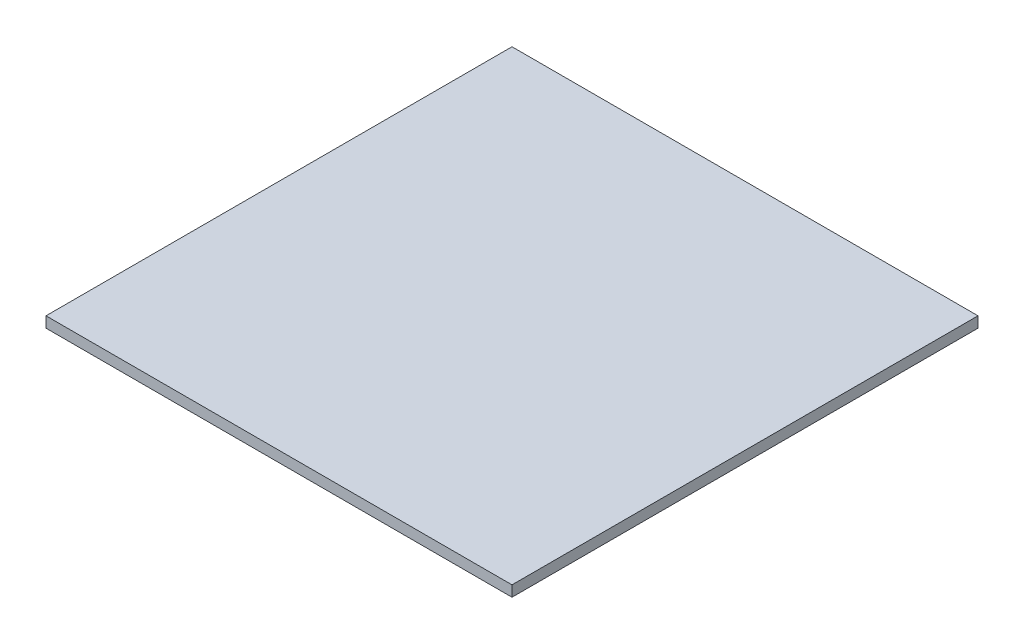
ISO-10303-21;
HEADER;
FILE_DESCRIPTION(('STEP AP214'),'2;1');
FILE_NAME('part.step','',(''),(''),'','','');
FILE_SCHEMA(('AUTOMOTIVE_DESIGN { 1 0 10303 214 1 1 1 1 }'));
ENDSEC;
DATA;
#1=APPLICATION_CONTEXT('core data for automotive mechanical design processes');
#2=APPLICATION_PROTOCOL_DEFINITION('international standard','automotive_design',2000,#1);
#3=PRODUCT_CONTEXT('',#1,'mechanical');
#4=PRODUCT('Part','Part','',(#3));
#5=PRODUCT_RELATED_PRODUCT_CATEGORY('part','',(#4));
#6=PRODUCT_DEFINITION_FORMATION('','',#4);
#7=PRODUCT_DEFINITION_CONTEXT('part definition',#1,'design');
#8=PRODUCT_DEFINITION('design','',#6,#7);
#9=PRODUCT_DEFINITION_SHAPE('','',#8);
#10=(LENGTH_UNIT() NAMED_UNIT(*) SI_UNIT(.MILLI.,.METRE.));
#11=(NAMED_UNIT(*) PLANE_ANGLE_UNIT() SI_UNIT($,.RADIAN.));
#12=(NAMED_UNIT(*) SI_UNIT($,.STERADIAN.) SOLID_ANGLE_UNIT());
#13=UNCERTAINTY_MEASURE_WITH_UNIT(LENGTH_MEASURE(1.E-05),#10,'distance_accuracy_value','');
#14=(GEOMETRIC_REPRESENTATION_CONTEXT(3) GLOBAL_UNCERTAINTY_ASSIGNED_CONTEXT((#13)) GLOBAL_UNIT_ASSIGNED_CONTEXT((#10,
#11,#12)) REPRESENTATION_CONTEXT('',''));
#15=CARTESIAN_POINT('',(0.,0.,0.));
#16=DIRECTION('',(0.,0.,1.));
#17=DIRECTION('',(1.,0.,0.));
#18=AXIS2_PLACEMENT_3D('',#15,#16,#17);
#19=CARTESIAN_POINT('',(130.,6.,130.));
#20=DIRECTION('',(-1.,0.,0.));
#21=DIRECTION('',(0.,0.,1.));
#22=AXIS2_PLACEMENT_3D('',#19,#20,#21);
#23=PLANE('',#22);
#24=DIRECTION('',(0.,0.,-1.));
#25=VECTOR('',#24,1.);
#26=CARTESIAN_POINT('',(130.,0.,130.));
#27=LINE('',#26,#25);
#28=CARTESIAN_POINT('',(130.,0.,130.));
#29=VERTEX_POINT('',#28);
#30=CARTESIAN_POINT('',(130.,0.,-130.));
#31=VERTEX_POINT('',#30);
#32=EDGE_CURVE('E107',#29,#31,#27,.T.);
#33=ORIENTED_EDGE('',*,*,#32,.T.);
#34=DIRECTION('',(0.,-1.,0.));
#35=VECTOR('',#34,1.);
#36=CARTESIAN_POINT('',(130.,6.,-130.));
#37=LINE('',#36,#35);
#38=CARTESIAN_POINT('',(130.,6.,-130.));
#39=VERTEX_POINT('',#38);
#40=EDGE_CURVE('E11',#39,#31,#37,.T.);
#41=ORIENTED_EDGE('',*,*,#40,.F.);
#42=DIRECTION('',(0.,0.,-1.));
#43=VECTOR('',#42,1.);
#44=CARTESIAN_POINT('',(130.,6.,130.));
#45=LINE('',#44,#43);
#46=CARTESIAN_POINT('',(130.,6.,130.));
#47=VERTEX_POINT('',#46);
#48=EDGE_CURVE('E91',#47,#39,#45,.T.);
#49=ORIENTED_EDGE('',*,*,#48,.F.);
#50=DIRECTION('',(0.,-1.,0.));
#51=VECTOR('',#50,1.);
#52=CARTESIAN_POINT('',(130.,6.,130.));
#53=LINE('',#52,#51);
#54=EDGE_CURVE('E103',#47,#29,#53,.T.);
#55=ORIENTED_EDGE('',*,*,#54,.T.);
#56=EDGE_LOOP('',(#33,#41,#49,#55));
#57=FACE_BOUND('',#56,.T.);
#58=ADVANCED_FACE('F39',(#57),#23,.F.);
#59=CARTESIAN_POINT('',(-130.,6.,-130.));
#60=DIRECTION('',(0.,0.,1.));
#61=DIRECTION('',(1.,0.,0.));
#62=AXIS2_PLACEMENT_3D('',#59,#60,#61);
#63=PLANE('',#62);
#64=DIRECTION('',(-1.,0.,0.));
#65=VECTOR('',#64,1.);
#66=CARTESIAN_POINT('',(-130.,0.,-130.));
#67=LINE('',#66,#65);
#68=CARTESIAN_POINT('',(-130.,0.,-130.));
#69=VERTEX_POINT('',#68);
#70=EDGE_CURVE('E96',#31,#69,#67,.T.);
#71=ORIENTED_EDGE('',*,*,#70,.T.);
#72=DIRECTION('',(0.,-1.,0.));
#73=VECTOR('',#72,1.);
#74=CARTESIAN_POINT('',(-130.,6.,-130.));
#75=LINE('',#74,#73);
#76=CARTESIAN_POINT('',(-130.,6.,-130.));
#77=VERTEX_POINT('',#76);
#78=EDGE_CURVE('E48',#77,#69,#75,.T.);
#79=ORIENTED_EDGE('',*,*,#78,.F.);
#80=DIRECTION('',(-1.,0.,0.));
#81=VECTOR('',#80,1.);
#82=CARTESIAN_POINT('',(-130.,6.,-130.));
#83=LINE('',#82,#81);
#84=EDGE_CURVE('E86',#39,#77,#83,.T.);
#85=ORIENTED_EDGE('',*,*,#84,.F.);
#86=ORIENTED_EDGE('',*,*,#40,.T.);
#87=EDGE_LOOP('',(#71,#79,#85,#86));
#88=FACE_BOUND('',#87,.T.);
#89=ADVANCED_FACE('F95',(#88),#63,.F.);
#90=CARTESIAN_POINT('',(-130.,6.,130.));
#91=DIRECTION('',(1.,0.,0.));
#92=DIRECTION('',(0.,0.,-1.));
#93=AXIS2_PLACEMENT_3D('',#90,#91,#92);
#94=PLANE('',#93);
#95=DIRECTION('',(0.,0.,1.));
#96=VECTOR('',#95,1.);
#97=CARTESIAN_POINT('',(-130.,0.,130.));
#98=LINE('',#97,#96);
#99=CARTESIAN_POINT('',(-130.,0.,130.));
#100=VERTEX_POINT('',#99);
#101=EDGE_CURVE('E73',#69,#100,#98,.T.);
#102=ORIENTED_EDGE('',*,*,#101,.T.);
#103=DIRECTION('',(0.,-1.,0.));
#104=VECTOR('',#103,1.);
#105=CARTESIAN_POINT('',(-130.,6.,130.));
#106=LINE('',#105,#104);
#107=CARTESIAN_POINT('',(-130.,6.,130.));
#108=VERTEX_POINT('',#107);
#109=EDGE_CURVE('E98',#108,#100,#106,.T.);
#110=ORIENTED_EDGE('',*,*,#109,.F.);
#111=DIRECTION('',(0.,0.,1.));
#112=VECTOR('',#111,1.);
#113=CARTESIAN_POINT('',(-130.,6.,130.));
#114=LINE('',#113,#112);
#115=EDGE_CURVE('E89',#77,#108,#114,.T.);
#116=ORIENTED_EDGE('',*,*,#115,.F.);
#117=ORIENTED_EDGE('',*,*,#78,.T.);
#118=EDGE_LOOP('',(#102,#110,#116,#117));
#119=FACE_BOUND('',#118,.T.);
#120=ADVANCED_FACE('F99',(#119),#94,.F.);
#121=CARTESIAN_POINT('',(-130.,6.,130.));
#122=DIRECTION('',(0.,0.,-1.));
#123=DIRECTION('',(-1.,0.,0.));
#124=AXIS2_PLACEMENT_3D('',#121,#122,#123);
#125=PLANE('',#124);
#126=DIRECTION('',(1.,0.,0.));
#127=VECTOR('',#126,1.);
#128=CARTESIAN_POINT('',(-130.,0.,130.));
#129=LINE('',#128,#127);
#130=EDGE_CURVE('E79',#100,#29,#129,.T.);
#131=ORIENTED_EDGE('',*,*,#130,.T.);
#132=ORIENTED_EDGE('',*,*,#54,.F.);
#133=DIRECTION('',(1.,0.,0.));
#134=VECTOR('',#133,1.);
#135=CARTESIAN_POINT('',(-130.,6.,130.));
#136=LINE('',#135,#134);
#137=EDGE_CURVE('E56',#108,#47,#136,.T.);
#138=ORIENTED_EDGE('',*,*,#137,.F.);
#139=ORIENTED_EDGE('',*,*,#109,.T.);
#140=EDGE_LOOP('',(#131,#132,#138,#139));
#141=FACE_BOUND('',#140,.T.);
#142=ADVANCED_FACE('F120',(#141),#125,.F.);
#143=CARTESIAN_POINT('',(0.,6.,0.));
#144=DIRECTION('',(0.,-1.,0.));
#145=DIRECTION('',(0.,0.,-1.));
#146=AXIS2_PLACEMENT_3D('',#143,#144,#145);
#147=PLANE('',#146);
#148=ORIENTED_EDGE('',*,*,#48,.T.);
#149=ORIENTED_EDGE('',*,*,#84,.T.);
#150=ORIENTED_EDGE('',*,*,#115,.T.);
#151=ORIENTED_EDGE('',*,*,#137,.T.);
#152=EDGE_LOOP('',(#148,#149,#150,#151));
#153=FACE_BOUND('',#152,.T.);
#154=ADVANCED_FACE('F87',(#153),#147,.F.);
#155=CARTESIAN_POINT('',(0.,0.,0.));
#156=DIRECTION('',(0.,-1.,0.));
#157=DIRECTION('',(0.,0.,-1.));
#158=AXIS2_PLACEMENT_3D('',#155,#156,#157);
#159=PLANE('',#158);
#160=ORIENTED_EDGE('',*,*,#32,.F.);
#161=ORIENTED_EDGE('',*,*,#130,.F.);
#162=ORIENTED_EDGE('',*,*,#101,.F.);
#163=ORIENTED_EDGE('',*,*,#70,.F.);
#164=EDGE_LOOP('',(#160,#161,#162,#163));
#165=FACE_BOUND('',#164,.T.);
#166=ADVANCED_FACE('F123',(#165),#159,.T.);
#167=CLOSED_SHELL('',(#58,#89,#120,#142,#154,#166));
#168=MANIFOLD_SOLID_BREP('B2',#167);
#169=ADVANCED_BREP_SHAPE_REPRESENTATION('',(#18,#168),#14);
#170=SHAPE_DEFINITION_REPRESENTATION(#9,#169);
ENDSEC;
END-ISO-10303-21;
